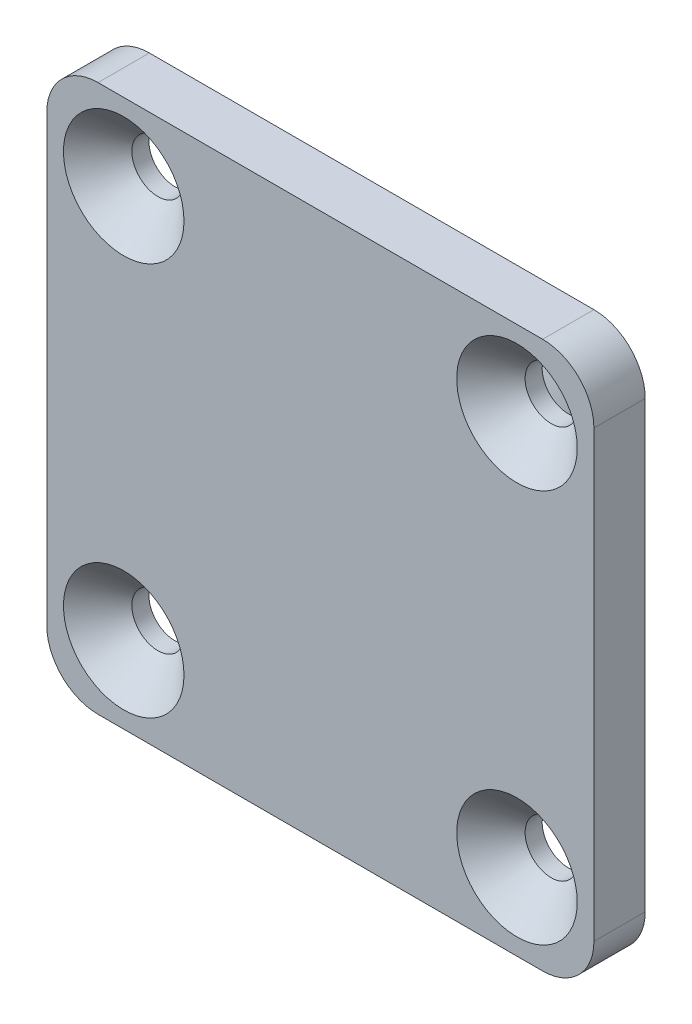
ISO-10303-21;
HEADER;
FILE_DESCRIPTION(('STEP AP214'),'2;1');
FILE_NAME('part.step','',(''),(''),'','','');
FILE_SCHEMA(('AUTOMOTIVE_DESIGN { 1 0 10303 214 1 1 1 1 }'));
ENDSEC;
DATA;
#1=APPLICATION_CONTEXT('core data for automotive mechanical design processes');
#2=APPLICATION_PROTOCOL_DEFINITION('international standard','automotive_design',2000,#1);
#3=PRODUCT_CONTEXT('',#1,'mechanical');
#4=PRODUCT('Part','Part','',(#3));
#5=PRODUCT_RELATED_PRODUCT_CATEGORY('part','',(#4));
#6=PRODUCT_DEFINITION_FORMATION('','',#4);
#7=PRODUCT_DEFINITION_CONTEXT('part definition',#1,'design');
#8=PRODUCT_DEFINITION('design','',#6,#7);
#9=PRODUCT_DEFINITION_SHAPE('','',#8);
#10=(LENGTH_UNIT() NAMED_UNIT(*) SI_UNIT(.MILLI.,.METRE.));
#11=(NAMED_UNIT(*) PLANE_ANGLE_UNIT() SI_UNIT($,.RADIAN.));
#12=(NAMED_UNIT(*) SI_UNIT($,.STERADIAN.) SOLID_ANGLE_UNIT());
#13=UNCERTAINTY_MEASURE_WITH_UNIT(LENGTH_MEASURE(1.E-05),#10,'distance_accuracy_value','');
#14=(GEOMETRIC_REPRESENTATION_CONTEXT(3) GLOBAL_UNCERTAINTY_ASSIGNED_CONTEXT((#13)) GLOBAL_UNIT_ASSIGNED_CONTEXT((#10,
#11,#12)) REPRESENTATION_CONTEXT('',''));
#15=CARTESIAN_POINT('',(0.,0.,0.));
#16=DIRECTION('',(0.,0.,1.));
#17=DIRECTION('',(1.,0.,0.));
#18=AXIS2_PLACEMENT_3D('',#15,#16,#17);
#19=CARTESIAN_POINT('',(-13.,13.,3.));
#20=DIRECTION('',(0.,0.,1.));
#21=DIRECTION('',(1.,0.,0.));
#22=AXIS2_PLACEMENT_3D('',#19,#20,#21);
#23=PLANE('',#22);
#24=CARTESIAN_POINT('',(-11.5,-11.5,3.));
#25=DIRECTION('',(0.,0.,1.));
#26=DIRECTION('',(1.,0.,0.));
#27=AXIS2_PLACEMENT_3D('',#24,#25,#26);
#28=CIRCLE('',#27,3.52500000000001);
#29=CARTESIAN_POINT('',(-7.97499999999999,-11.5,3.));
#30=VERTEX_POINT('',#29);
#31=EDGE_CURVE('E176',#30,#30,#28,.F.);
#32=ORIENTED_EDGE('',*,*,#31,.T.);
#33=EDGE_LOOP('',(#32));
#34=FACE_BOUND('',#33,.T.);
#35=CARTESIAN_POINT('',(11.5,-11.5,3.));
#36=DIRECTION('',(0.,0.,1.));
#37=DIRECTION('',(1.,0.,0.));
#38=AXIS2_PLACEMENT_3D('',#35,#36,#37);
#39=CIRCLE('',#38,3.52500000000001);
#40=CARTESIAN_POINT('',(15.025,-11.5,3.));
#41=VERTEX_POINT('',#40);
#42=EDGE_CURVE('E173',#41,#41,#39,.F.);
#43=ORIENTED_EDGE('',*,*,#42,.T.);
#44=EDGE_LOOP('',(#43));
#45=FACE_BOUND('',#44,.T.);
#46=CARTESIAN_POINT('',(11.5,11.5,3.));
#47=DIRECTION('',(0.,0.,1.));
#48=DIRECTION('',(1.,0.,0.));
#49=AXIS2_PLACEMENT_3D('',#46,#47,#48);
#50=CIRCLE('',#49,3.52500000000001);
#51=CARTESIAN_POINT('',(15.025,11.5,3.));
#52=VERTEX_POINT('',#51);
#53=EDGE_CURVE('E170',#52,#52,#50,.F.);
#54=ORIENTED_EDGE('',*,*,#53,.T.);
#55=EDGE_LOOP('',(#54));
#56=FACE_BOUND('',#55,.T.);
#57=CARTESIAN_POINT('',(-11.5,11.5,3.));
#58=DIRECTION('',(0.,0.,1.));
#59=DIRECTION('',(1.,0.,0.));
#60=AXIS2_PLACEMENT_3D('',#57,#58,#59);
#61=CIRCLE('',#60,3.52500000000001);
#62=CARTESIAN_POINT('',(-7.97499999999999,11.5,3.));
#63=VERTEX_POINT('',#62);
#64=EDGE_CURVE('E167',#63,#63,#61,.F.);
#65=ORIENTED_EDGE('',*,*,#64,.T.);
#66=EDGE_LOOP('',(#65));
#67=FACE_BOUND('',#66,.T.);
#68=CARTESIAN_POINT('',(-13.,13.,3.));
#69=DIRECTION('',(0.,0.,1.));
#70=DIRECTION('',(1.,0.,0.));
#71=AXIS2_PLACEMENT_3D('',#68,#69,#70);
#72=CIRCLE('',#71,3.);
#73=CARTESIAN_POINT('',(-13.,16.,3.));
#74=VERTEX_POINT('',#73);
#75=CARTESIAN_POINT('',(-16.,13.,3.));
#76=VERTEX_POINT('',#75);
#77=EDGE_CURVE('E146',#74,#76,#72,.T.);
#78=ORIENTED_EDGE('',*,*,#77,.T.);
#79=DIRECTION('',(0.,-1.,0.));
#80=VECTOR('',#79,1.);
#81=CARTESIAN_POINT('',(-16.,13.,3.));
#82=LINE('',#81,#80);
#83=CARTESIAN_POINT('',(-16.,-13.,3.));
#84=VERTEX_POINT('',#83);
#85=EDGE_CURVE('E95',#76,#84,#82,.T.);
#86=ORIENTED_EDGE('',*,*,#85,.T.);
#87=CARTESIAN_POINT('',(-13.,-13.,3.));
#88=DIRECTION('',(0.,0.,1.));
#89=DIRECTION('',(1.,0.,0.));
#90=AXIS2_PLACEMENT_3D('',#87,#88,#89);
#91=CIRCLE('',#90,3.);
#92=CARTESIAN_POINT('',(-13.,-16.,3.));
#93=VERTEX_POINT('',#92);
#94=EDGE_CURVE('E267',#84,#93,#91,.T.);
#95=ORIENTED_EDGE('',*,*,#94,.T.);
#96=DIRECTION('',(1.,0.,0.));
#97=VECTOR('',#96,1.);
#98=CARTESIAN_POINT('',(-13.,-16.,3.));
#99=LINE('',#98,#97);
#100=CARTESIAN_POINT('',(13.,-16.,3.));
#101=VERTEX_POINT('',#100);
#102=EDGE_CURVE('E269',#93,#101,#99,.T.);
#103=ORIENTED_EDGE('',*,*,#102,.T.);
#104=CARTESIAN_POINT('',(13.,-13.,3.));
#105=DIRECTION('',(0.,0.,1.));
#106=DIRECTION('',(1.,0.,0.));
#107=AXIS2_PLACEMENT_3D('',#104,#105,#106);
#108=CIRCLE('',#107,3.);
#109=CARTESIAN_POINT('',(16.,-13.,3.));
#110=VERTEX_POINT('',#109);
#111=EDGE_CURVE('E113',#101,#110,#108,.T.);
#112=ORIENTED_EDGE('',*,*,#111,.T.);
#113=DIRECTION('',(0.,1.,0.));
#114=VECTOR('',#113,1.);
#115=CARTESIAN_POINT('',(16.,-13.,3.));
#116=LINE('',#115,#114);
#117=CARTESIAN_POINT('',(16.,13.,3.));
#118=VERTEX_POINT('',#117);
#119=EDGE_CURVE('E108',#110,#118,#116,.T.);
#120=ORIENTED_EDGE('',*,*,#119,.T.);
#121=CARTESIAN_POINT('',(13.,13.,3.));
#122=DIRECTION('',(0.,0.,1.));
#123=DIRECTION('',(1.,0.,0.));
#124=AXIS2_PLACEMENT_3D('',#121,#122,#123);
#125=CIRCLE('',#124,3.);
#126=CARTESIAN_POINT('',(13.,16.,3.));
#127=VERTEX_POINT('',#126);
#128=EDGE_CURVE('E111',#118,#127,#125,.T.);
#129=ORIENTED_EDGE('',*,*,#128,.T.);
#130=DIRECTION('',(-1.,0.,0.));
#131=VECTOR('',#130,1.);
#132=CARTESIAN_POINT('',(13.,16.,3.));
#133=LINE('',#132,#131);
#134=EDGE_CURVE('E51',#127,#74,#133,.T.);
#135=ORIENTED_EDGE('',*,*,#134,.T.);
#136=EDGE_LOOP('',(#78,#86,#95,#103,#112,#120,#129,#135));
#137=FACE_BOUND('',#136,.T.);
#138=ADVANCED_FACE('F34',(#34,#45,#56,#67,#137),#23,.T.);
#139=CARTESIAN_POINT('',(-13.,13.,0.));
#140=DIRECTION('',(0.,0.,1.));
#141=DIRECTION('',(1.,0.,0.));
#142=AXIS2_PLACEMENT_3D('',#139,#140,#141);
#143=PLANE('',#142);
#144=CARTESIAN_POINT('',(0.,0.,0.));
#145=DIRECTION('',(0.,0.,1.));
#146=DIRECTION('',(1.,0.,0.));
#147=AXIS2_PLACEMENT_3D('',#144,#145,#146);
#148=CIRCLE('',#147,10.);
#149=CARTESIAN_POINT('',(10.,0.,0.));
#150=VERTEX_POINT('',#149);
#151=EDGE_CURVE('E161',#150,#150,#148,.F.);
#152=ORIENTED_EDGE('',*,*,#151,.F.);
#153=EDGE_LOOP('',(#152));
#154=FACE_BOUND('',#153,.T.);
#155=CARTESIAN_POINT('',(-13.,13.,0.));
#156=DIRECTION('',(0.,0.,1.));
#157=DIRECTION('',(1.,0.,0.));
#158=AXIS2_PLACEMENT_3D('',#155,#156,#157);
#159=CIRCLE('',#158,3.);
#160=CARTESIAN_POINT('',(-13.,16.,0.));
#161=VERTEX_POINT('',#160);
#162=CARTESIAN_POINT('',(-16.,13.,0.));
#163=VERTEX_POINT('',#162);
#164=EDGE_CURVE('E131',#161,#163,#159,.T.);
#165=ORIENTED_EDGE('',*,*,#164,.F.);
#166=DIRECTION('',(-1.,0.,0.));
#167=VECTOR('',#166,1.);
#168=CARTESIAN_POINT('',(13.,16.,0.));
#169=LINE('',#168,#167);
#170=CARTESIAN_POINT('',(13.,16.,0.));
#171=VERTEX_POINT('',#170);
#172=EDGE_CURVE('E86',#171,#161,#169,.T.);
#173=ORIENTED_EDGE('',*,*,#172,.F.);
#174=CARTESIAN_POINT('',(13.,13.,0.));
#175=DIRECTION('',(0.,0.,1.));
#176=DIRECTION('',(1.,0.,0.));
#177=AXIS2_PLACEMENT_3D('',#174,#175,#176);
#178=CIRCLE('',#177,3.);
#179=CARTESIAN_POINT('',(16.,13.,0.));
#180=VERTEX_POINT('',#179);
#181=EDGE_CURVE('E80',#180,#171,#178,.T.);
#182=ORIENTED_EDGE('',*,*,#181,.F.);
#183=DIRECTION('',(0.,1.,0.));
#184=VECTOR('',#183,1.);
#185=CARTESIAN_POINT('',(16.,-13.,0.));
#186=LINE('',#185,#184);
#187=CARTESIAN_POINT('',(16.,-13.,0.));
#188=VERTEX_POINT('',#187);
#189=EDGE_CURVE('E121',#188,#180,#186,.T.);
#190=ORIENTED_EDGE('',*,*,#189,.F.);
#191=CARTESIAN_POINT('',(13.,-13.,0.));
#192=DIRECTION('',(0.,0.,1.));
#193=DIRECTION('',(1.,0.,0.));
#194=AXIS2_PLACEMENT_3D('',#191,#192,#193);
#195=CIRCLE('',#194,3.);
#196=CARTESIAN_POINT('',(13.,-16.,0.));
#197=VERTEX_POINT('',#196);
#198=EDGE_CURVE('E141',#197,#188,#195,.T.);
#199=ORIENTED_EDGE('',*,*,#198,.F.);
#200=DIRECTION('',(1.,0.,0.));
#201=VECTOR('',#200,1.);
#202=CARTESIAN_POINT('',(-13.,-16.,0.));
#203=LINE('',#202,#201);
#204=CARTESIAN_POINT('',(-13.,-16.,0.));
#205=VERTEX_POINT('',#204);
#206=EDGE_CURVE('E139',#205,#197,#203,.T.);
#207=ORIENTED_EDGE('',*,*,#206,.F.);
#208=CARTESIAN_POINT('',(-13.,-13.,0.));
#209=DIRECTION('',(0.,0.,1.));
#210=DIRECTION('',(1.,0.,0.));
#211=AXIS2_PLACEMENT_3D('',#208,#209,#210);
#212=CIRCLE('',#211,3.);
#213=CARTESIAN_POINT('',(-16.,-13.,0.));
#214=VERTEX_POINT('',#213);
#215=EDGE_CURVE('E137',#214,#205,#212,.T.);
#216=ORIENTED_EDGE('',*,*,#215,.F.);
#217=DIRECTION('',(0.,-1.,0.));
#218=VECTOR('',#217,1.);
#219=CARTESIAN_POINT('',(-16.,13.,0.));
#220=LINE('',#219,#218);
#221=EDGE_CURVE('E134',#163,#214,#220,.T.);
#222=ORIENTED_EDGE('',*,*,#221,.F.);
#223=EDGE_LOOP('',(#165,#173,#182,#190,#199,#207,#216,#222));
#224=FACE_BOUND('',#223,.T.);
#225=CARTESIAN_POINT('',(-11.5,-11.5,0.));
#226=DIRECTION('',(0.,0.,1.));
#227=DIRECTION('',(1.,0.,0.));
#228=AXIS2_PLACEMENT_3D('',#225,#226,#227);
#229=CIRCLE('',#228,1.525);
#230=CARTESIAN_POINT('',(-9.975,-11.5,0.));
#231=VERTEX_POINT('',#230);
#232=EDGE_CURVE('E135',#231,#231,#229,.T.);
#233=ORIENTED_EDGE('',*,*,#232,.T.);
#234=EDGE_LOOP('',(#233));
#235=FACE_BOUND('',#234,.T.);
#236=CARTESIAN_POINT('',(11.5,-11.5,0.));
#237=DIRECTION('',(0.,0.,1.));
#238=DIRECTION('',(1.,0.,0.));
#239=AXIS2_PLACEMENT_3D('',#236,#237,#238);
#240=CIRCLE('',#239,1.525);
#241=CARTESIAN_POINT('',(13.025,-11.5,0.));
#242=VERTEX_POINT('',#241);
#243=EDGE_CURVE('E258',#242,#242,#240,.T.);
#244=ORIENTED_EDGE('',*,*,#243,.T.);
#245=EDGE_LOOP('',(#244));
#246=FACE_BOUND('',#245,.T.);
#247=CARTESIAN_POINT('',(11.5,11.5,0.));
#248=DIRECTION('',(0.,0.,1.));
#249=DIRECTION('',(1.,0.,0.));
#250=AXIS2_PLACEMENT_3D('',#247,#248,#249);
#251=CIRCLE('',#250,1.525);
#252=CARTESIAN_POINT('',(13.025,11.5,0.));
#253=VERTEX_POINT('',#252);
#254=EDGE_CURVE('E261',#253,#253,#251,.T.);
#255=ORIENTED_EDGE('',*,*,#254,.T.);
#256=EDGE_LOOP('',(#255));
#257=FACE_BOUND('',#256,.T.);
#258=CARTESIAN_POINT('',(-11.5,11.5,0.));
#259=DIRECTION('',(0.,0.,1.));
#260=DIRECTION('',(1.,0.,0.));
#261=AXIS2_PLACEMENT_3D('',#258,#259,#260);
#262=CIRCLE('',#261,1.525);
#263=CARTESIAN_POINT('',(-9.975,11.5,0.));
#264=VERTEX_POINT('',#263);
#265=EDGE_CURVE('E289',#264,#264,#262,.T.);
#266=ORIENTED_EDGE('',*,*,#265,.T.);
#267=EDGE_LOOP('',(#266));
#268=FACE_BOUND('',#267,.T.);
#269=ADVANCED_FACE('F201',(#154,#224,#235,#246,#257,#268),#143,.F.);
#270=CARTESIAN_POINT('',(-13.,13.,3.));
#271=DIRECTION('',(0.,0.,-1.));
#272=DIRECTION('',(-1.,0.,0.));
#273=AXIS2_PLACEMENT_3D('',#270,#271,#272);
#274=CYLINDRICAL_SURFACE('',#273,3.);
#275=ORIENTED_EDGE('',*,*,#164,.T.);
#276=DIRECTION('',(0.,0.,-1.));
#277=VECTOR('',#276,1.);
#278=CARTESIAN_POINT('',(-16.,13.,3.));
#279=LINE('',#278,#277);
#280=EDGE_CURVE('E159',#76,#163,#279,.T.);
#281=ORIENTED_EDGE('',*,*,#280,.F.);
#282=ORIENTED_EDGE('',*,*,#77,.F.);
#283=DIRECTION('',(0.,0.,-1.));
#284=VECTOR('',#283,1.);
#285=CARTESIAN_POINT('',(-13.,16.,3.));
#286=LINE('',#285,#284);
#287=EDGE_CURVE('E127',#74,#161,#286,.T.);
#288=ORIENTED_EDGE('',*,*,#287,.T.);
#289=EDGE_LOOP('',(#275,#281,#282,#288));
#290=FACE_BOUND('',#289,.T.);
#291=ADVANCED_FACE('F207',(#290),#274,.T.);
#292=CARTESIAN_POINT('',(-16.,13.,3.));
#293=DIRECTION('',(1.,0.,0.));
#294=DIRECTION('',(0.,0.,-1.));
#295=AXIS2_PLACEMENT_3D('',#292,#293,#294);
#296=PLANE('',#295);
#297=ORIENTED_EDGE('',*,*,#221,.T.);
#298=DIRECTION('',(0.,0.,-1.));
#299=VECTOR('',#298,1.);
#300=CARTESIAN_POINT('',(-16.,-13.,3.));
#301=LINE('',#300,#299);
#302=EDGE_CURVE('E156',#84,#214,#301,.T.);
#303=ORIENTED_EDGE('',*,*,#302,.F.);
#304=ORIENTED_EDGE('',*,*,#85,.F.);
#305=ORIENTED_EDGE('',*,*,#280,.T.);
#306=EDGE_LOOP('',(#297,#303,#304,#305));
#307=FACE_BOUND('',#306,.T.);
#308=ADVANCED_FACE('F234',(#307),#296,.F.);
#309=CARTESIAN_POINT('',(-13.,-13.,3.));
#310=DIRECTION('',(0.,0.,-1.));
#311=DIRECTION('',(-1.,0.,0.));
#312=AXIS2_PLACEMENT_3D('',#309,#310,#311);
#313=CYLINDRICAL_SURFACE('',#312,3.);
#314=ORIENTED_EDGE('',*,*,#215,.T.);
#315=DIRECTION('',(0.,0.,-1.));
#316=VECTOR('',#315,1.);
#317=CARTESIAN_POINT('',(-13.,-16.,3.));
#318=LINE('',#317,#316);
#319=EDGE_CURVE('E153',#93,#205,#318,.T.);
#320=ORIENTED_EDGE('',*,*,#319,.F.);
#321=ORIENTED_EDGE('',*,*,#94,.F.);
#322=ORIENTED_EDGE('',*,*,#302,.T.);
#323=EDGE_LOOP('',(#314,#320,#321,#322));
#324=FACE_BOUND('',#323,.T.);
#325=ADVANCED_FACE('F230',(#324),#313,.T.);
#326=CARTESIAN_POINT('',(-13.,-16.,3.));
#327=DIRECTION('',(0.,1.,0.));
#328=DIRECTION('',(0.,0.,1.));
#329=AXIS2_PLACEMENT_3D('',#326,#327,#328);
#330=PLANE('',#329);
#331=ORIENTED_EDGE('',*,*,#206,.T.);
#332=DIRECTION('',(0.,0.,-1.));
#333=VECTOR('',#332,1.);
#334=CARTESIAN_POINT('',(13.,-16.,3.));
#335=LINE('',#334,#333);
#336=EDGE_CURVE('E150',#101,#197,#335,.T.);
#337=ORIENTED_EDGE('',*,*,#336,.F.);
#338=ORIENTED_EDGE('',*,*,#102,.F.);
#339=ORIENTED_EDGE('',*,*,#319,.T.);
#340=EDGE_LOOP('',(#331,#337,#338,#339));
#341=FACE_BOUND('',#340,.T.);
#342=ADVANCED_FACE('F226',(#341),#330,.F.);
#343=CARTESIAN_POINT('',(13.,-13.,3.));
#344=DIRECTION('',(0.,0.,-1.));
#345=DIRECTION('',(-1.,0.,0.));
#346=AXIS2_PLACEMENT_3D('',#343,#344,#345);
#347=CYLINDRICAL_SURFACE('',#346,3.);
#348=ORIENTED_EDGE('',*,*,#198,.T.);
#349=DIRECTION('',(0.,0.,-1.));
#350=VECTOR('',#349,1.);
#351=CARTESIAN_POINT('',(16.,-13.,3.));
#352=LINE('',#351,#350);
#353=EDGE_CURVE('E122',#110,#188,#352,.T.);
#354=ORIENTED_EDGE('',*,*,#353,.F.);
#355=ORIENTED_EDGE('',*,*,#111,.F.);
#356=ORIENTED_EDGE('',*,*,#336,.T.);
#357=EDGE_LOOP('',(#348,#354,#355,#356));
#358=FACE_BOUND('',#357,.T.);
#359=ADVANCED_FACE('F223',(#358),#347,.T.);
#360=CARTESIAN_POINT('',(16.,-13.,3.));
#361=DIRECTION('',(-1.,0.,0.));
#362=DIRECTION('',(0.,0.,1.));
#363=AXIS2_PLACEMENT_3D('',#360,#361,#362);
#364=PLANE('',#363);
#365=ORIENTED_EDGE('',*,*,#189,.T.);
#366=DIRECTION('',(0.,0.,-1.));
#367=VECTOR('',#366,1.);
#368=CARTESIAN_POINT('',(16.,13.,3.));
#369=LINE('',#368,#367);
#370=EDGE_CURVE('E118',#118,#180,#369,.T.);
#371=ORIENTED_EDGE('',*,*,#370,.F.);
#372=ORIENTED_EDGE('',*,*,#119,.F.);
#373=ORIENTED_EDGE('',*,*,#353,.T.);
#374=EDGE_LOOP('',(#365,#371,#372,#373));
#375=FACE_BOUND('',#374,.T.);
#376=ADVANCED_FACE('F119',(#375),#364,.F.);
#377=CARTESIAN_POINT('',(13.,13.,3.));
#378=DIRECTION('',(0.,0.,-1.));
#379=DIRECTION('',(-1.,0.,0.));
#380=AXIS2_PLACEMENT_3D('',#377,#378,#379);
#381=CYLINDRICAL_SURFACE('',#380,3.);
#382=ORIENTED_EDGE('',*,*,#181,.T.);
#383=DIRECTION('',(0.,0.,-1.));
#384=VECTOR('',#383,1.);
#385=CARTESIAN_POINT('',(13.,16.,3.));
#386=LINE('',#385,#384);
#387=EDGE_CURVE('E123',#127,#171,#386,.T.);
#388=ORIENTED_EDGE('',*,*,#387,.F.);
#389=ORIENTED_EDGE('',*,*,#128,.F.);
#390=ORIENTED_EDGE('',*,*,#370,.T.);
#391=EDGE_LOOP('',(#382,#388,#389,#390));
#392=FACE_BOUND('',#391,.T.);
#393=ADVANCED_FACE('F125',(#392),#381,.T.);
#394=CARTESIAN_POINT('',(13.,16.,3.));
#395=DIRECTION('',(0.,-1.,0.));
#396=DIRECTION('',(0.,0.,-1.));
#397=AXIS2_PLACEMENT_3D('',#394,#395,#396);
#398=PLANE('',#397);
#399=ORIENTED_EDGE('',*,*,#172,.T.);
#400=ORIENTED_EDGE('',*,*,#287,.F.);
#401=ORIENTED_EDGE('',*,*,#134,.F.);
#402=ORIENTED_EDGE('',*,*,#387,.T.);
#403=EDGE_LOOP('',(#399,#400,#401,#402));
#404=FACE_BOUND('',#403,.T.);
#405=ADVANCED_FACE('F216',(#404),#398,.F.);
#406=CARTESIAN_POINT('',(-11.5,-11.5,3.));
#407=DIRECTION('',(0.,0.,-1.));
#408=DIRECTION('',(-1.,0.,0.));
#409=AXIS2_PLACEMENT_3D('',#406,#407,#408);
#410=CYLINDRICAL_SURFACE('',#409,1.525);
#411=CARTESIAN_POINT('',(-11.5,-11.5,0.999999999999995));
#412=DIRECTION('',(0.,0.,1.));
#413=DIRECTION('',(1.,0.,0.));
#414=AXIS2_PLACEMENT_3D('',#411,#412,#413);
#415=CIRCLE('',#414,1.525);
#416=CARTESIAN_POINT('',(-9.975,-11.5,0.999999999999995));
#417=VERTEX_POINT('',#416);
#418=EDGE_CURVE('E164',#417,#417,#415,.T.);
#419=ORIENTED_EDGE('',*,*,#418,.T.);
#420=EDGE_LOOP('',(#419));
#421=FACE_BOUND('',#420,.T.);
#422=ORIENTED_EDGE('',*,*,#232,.F.);
#423=EDGE_LOOP('',(#422));
#424=FACE_BOUND('',#423,.T.);
#425=ADVANCED_FACE('F213',(#421,#424),#410,.F.);
#426=CARTESIAN_POINT('',(11.5,-11.5,3.));
#427=DIRECTION('',(0.,0.,-1.));
#428=DIRECTION('',(-1.,0.,0.));
#429=AXIS2_PLACEMENT_3D('',#426,#427,#428);
#430=CYLINDRICAL_SURFACE('',#429,1.525);
#431=CARTESIAN_POINT('',(11.5,-11.5,0.999999999999995));
#432=DIRECTION('',(0.,0.,1.));
#433=DIRECTION('',(1.,0.,0.));
#434=AXIS2_PLACEMENT_3D('',#431,#432,#433);
#435=CIRCLE('',#434,1.525);
#436=CARTESIAN_POINT('',(13.025,-11.5,0.999999999999995));
#437=VERTEX_POINT('',#436);
#438=EDGE_CURVE('E179',#437,#437,#435,.T.);
#439=ORIENTED_EDGE('',*,*,#438,.T.);
#440=EDGE_LOOP('',(#439));
#441=FACE_BOUND('',#440,.T.);
#442=ORIENTED_EDGE('',*,*,#243,.F.);
#443=EDGE_LOOP('',(#442));
#444=FACE_BOUND('',#443,.T.);
#445=ADVANCED_FACE('F254',(#441,#444),#430,.F.);
#446=CARTESIAN_POINT('',(11.5,11.5,3.));
#447=DIRECTION('',(0.,0.,-1.));
#448=DIRECTION('',(-1.,0.,0.));
#449=AXIS2_PLACEMENT_3D('',#446,#447,#448);
#450=CYLINDRICAL_SURFACE('',#449,1.525);
#451=CARTESIAN_POINT('',(11.5,11.5,0.999999999999995));
#452=DIRECTION('',(0.,0.,1.));
#453=DIRECTION('',(1.,0.,0.));
#454=AXIS2_PLACEMENT_3D('',#451,#452,#453);
#455=CIRCLE('',#454,1.525);
#456=CARTESIAN_POINT('',(13.025,11.5,0.999999999999995));
#457=VERTEX_POINT('',#456);
#458=EDGE_CURVE('E43',#457,#457,#455,.T.);
#459=ORIENTED_EDGE('',*,*,#458,.T.);
#460=EDGE_LOOP('',(#459));
#461=FACE_BOUND('',#460,.T.);
#462=ORIENTED_EDGE('',*,*,#254,.F.);
#463=EDGE_LOOP('',(#462));
#464=FACE_BOUND('',#463,.T.);
#465=ADVANCED_FACE('F184',(#461,#464),#450,.F.);
#466=CARTESIAN_POINT('',(-11.5,11.5,3.));
#467=DIRECTION('',(0.,0.,-1.));
#468=DIRECTION('',(-1.,0.,0.));
#469=AXIS2_PLACEMENT_3D('',#466,#467,#468);
#470=CYLINDRICAL_SURFACE('',#469,1.525);
#471=CARTESIAN_POINT('',(-11.5,11.5,0.999999999999995));
#472=DIRECTION('',(0.,0.,1.));
#473=DIRECTION('',(1.,0.,0.));
#474=AXIS2_PLACEMENT_3D('',#471,#472,#473);
#475=CIRCLE('',#474,1.525);
#476=CARTESIAN_POINT('',(-9.975,11.5,0.999999999999995));
#477=VERTEX_POINT('',#476);
#478=EDGE_CURVE('E11',#477,#477,#475,.T.);
#479=ORIENTED_EDGE('',*,*,#478,.T.);
#480=EDGE_LOOP('',(#479));
#481=FACE_BOUND('',#480,.T.);
#482=ORIENTED_EDGE('',*,*,#265,.F.);
#483=EDGE_LOOP('',(#482));
#484=FACE_BOUND('',#483,.T.);
#485=ADVANCED_FACE('F308',(#481,#484),#470,.F.);
#486=CARTESIAN_POINT('',(0.,0.,-5.1));
#487=DIRECTION('',(0.,0.,-1.));
#488=DIRECTION('',(-1.,0.,0.));
#489=AXIS2_PLACEMENT_3D('',#486,#487,#488);
#490=PLANE('',#489);
#491=CARTESIAN_POINT('',(0.,0.,-5.1));
#492=DIRECTION('',(0.,0.,-1.));
#493=DIRECTION('',(-1.,0.,0.));
#494=AXIS2_PLACEMENT_3D('',#491,#492,#493);
#495=CIRCLE('',#494,10.);
#496=CARTESIAN_POINT('',(-10.,0.,-5.1));
#497=VERTEX_POINT('',#496);
#498=EDGE_CURVE('E291',#497,#497,#495,.T.);
#499=ORIENTED_EDGE('',*,*,#498,.T.);
#500=EDGE_LOOP('',(#499));
#501=FACE_BOUND('',#500,.T.);
#502=CARTESIAN_POINT('',(0.,0.,-5.1));
#503=DIRECTION('',(0.,0.,-1.));
#504=DIRECTION('',(-1.,0.,0.));
#505=AXIS2_PLACEMENT_3D('',#502,#503,#504);
#506=CIRCLE('',#505,7.);
#507=CARTESIAN_POINT('',(-7.,0.,-5.1));
#508=VERTEX_POINT('',#507);
#509=EDGE_CURVE('E294',#508,#508,#506,.T.);
#510=ORIENTED_EDGE('',*,*,#509,.F.);
#511=EDGE_LOOP('',(#510));
#512=FACE_BOUND('',#511,.T.);
#513=ADVANCED_FACE('F305',(#501,#512),#490,.T.);
#514=CARTESIAN_POINT('',(0.,0.,-5.1));
#515=DIRECTION('',(0.,0.,1.));
#516=DIRECTION('',(1.,0.,0.));
#517=AXIS2_PLACEMENT_3D('',#514,#515,#516);
#518=CYLINDRICAL_SURFACE('',#517,10.);
#519=ORIENTED_EDGE('',*,*,#498,.F.);
#520=EDGE_LOOP('',(#519));
#521=FACE_BOUND('',#520,.T.);
#522=ORIENTED_EDGE('',*,*,#151,.T.);
#523=EDGE_LOOP('',(#522));
#524=FACE_BOUND('',#523,.T.);
#525=ADVANCED_FACE('F307',(#521,#524),#518,.T.);
#526=CARTESIAN_POINT('',(0.,0.,-5.1));
#527=DIRECTION('',(0.,0.,1.));
#528=DIRECTION('',(1.,0.,0.));
#529=AXIS2_PLACEMENT_3D('',#526,#527,#528);
#530=CYLINDRICAL_SURFACE('',#529,7.);
#531=ORIENTED_EDGE('',*,*,#509,.T.);
#532=EDGE_LOOP('',(#531));
#533=FACE_BOUND('',#532,.T.);
#534=CARTESIAN_POINT('',(0.,0.,0.));
#535=DIRECTION('',(0.,0.,-1.));
#536=DIRECTION('',(-1.,0.,0.));
#537=AXIS2_PLACEMENT_3D('',#534,#535,#536);
#538=CIRCLE('',#537,7.);
#539=CARTESIAN_POINT('',(-7.,0.,0.));
#540=VERTEX_POINT('',#539);
#541=EDGE_CURVE('E297',#540,#540,#538,.T.);
#542=ORIENTED_EDGE('',*,*,#541,.F.);
#543=EDGE_LOOP('',(#542));
#544=FACE_BOUND('',#543,.T.);
#545=ADVANCED_FACE('F246',(#533,#544),#530,.F.);
#546=ORIENTED_EDGE('',*,*,#541,.T.);
#547=EDGE_LOOP('',(#546));
#548=FACE_BOUND('',#547,.T.);
#549=ADVANCED_FACE('F210',(#548),#143,.F.);
#550=CARTESIAN_POINT('',(-11.5,-11.5,0.999999999999995));
#551=DIRECTION('',(0.,0.,1.));
#552=DIRECTION('',(1.,0.,0.));
#553=AXIS2_PLACEMENT_3D('',#550,#551,#552);
#554=CONICAL_SURFACE('',#553,1.525,0.785398163397449);
#555=ORIENTED_EDGE('',*,*,#31,.F.);
#556=EDGE_LOOP('',(#555));
#557=FACE_BOUND('',#556,.T.);
#558=ORIENTED_EDGE('',*,*,#418,.F.);
#559=EDGE_LOOP('',(#558));
#560=FACE_BOUND('',#559,.T.);
#561=ADVANCED_FACE('F196',(#557,#560),#554,.F.);
#562=CARTESIAN_POINT('',(11.5,-11.5,0.999999999999995));
#563=DIRECTION('',(0.,0.,1.));
#564=DIRECTION('',(1.,0.,0.));
#565=AXIS2_PLACEMENT_3D('',#562,#563,#564);
#566=CONICAL_SURFACE('',#565,1.525,0.785398163397449);
#567=ORIENTED_EDGE('',*,*,#42,.F.);
#568=EDGE_LOOP('',(#567));
#569=FACE_BOUND('',#568,.T.);
#570=ORIENTED_EDGE('',*,*,#438,.F.);
#571=EDGE_LOOP('',(#570));
#572=FACE_BOUND('',#571,.T.);
#573=ADVANCED_FACE('F189',(#569,#572),#566,.F.);
#574=CARTESIAN_POINT('',(11.5,11.5,0.999999999999995));
#575=DIRECTION('',(0.,0.,1.));
#576=DIRECTION('',(1.,0.,0.));
#577=AXIS2_PLACEMENT_3D('',#574,#575,#576);
#578=CONICAL_SURFACE('',#577,1.525,0.785398163397449);
#579=ORIENTED_EDGE('',*,*,#53,.F.);
#580=EDGE_LOOP('',(#579));
#581=FACE_BOUND('',#580,.T.);
#582=ORIENTED_EDGE('',*,*,#458,.F.);
#583=EDGE_LOOP('',(#582));
#584=FACE_BOUND('',#583,.T.);
#585=ADVANCED_FACE('F187',(#581,#584),#578,.F.);
#586=CARTESIAN_POINT('',(-11.5,11.5,0.999999999999995));
#587=DIRECTION('',(0.,0.,1.));
#588=DIRECTION('',(1.,0.,0.));
#589=AXIS2_PLACEMENT_3D('',#586,#587,#588);
#590=CONICAL_SURFACE('',#589,1.525,0.785398163397449);
#591=ORIENTED_EDGE('',*,*,#64,.F.);
#592=EDGE_LOOP('',(#591));
#593=FACE_BOUND('',#592,.T.);
#594=ORIENTED_EDGE('',*,*,#478,.F.);
#595=EDGE_LOOP('',(#594));
#596=FACE_BOUND('',#595,.T.);
#597=ADVANCED_FACE('F36',(#593,#596),#590,.F.);
#598=CLOSED_SHELL('',(#138,#269,#291,#308,#325,#342,#359,#376,#393,#405,#425,#445,#465,#485,
#513,#525,#545,#549,#561,#573,#585,#597));
#599=MANIFOLD_SOLID_BREP('B2',#598);
#600=ADVANCED_BREP_SHAPE_REPRESENTATION('',(#18,#599),#14);
#601=SHAPE_DEFINITION_REPRESENTATION(#9,#600);
ENDSEC;
END-ISO-10303-21;
